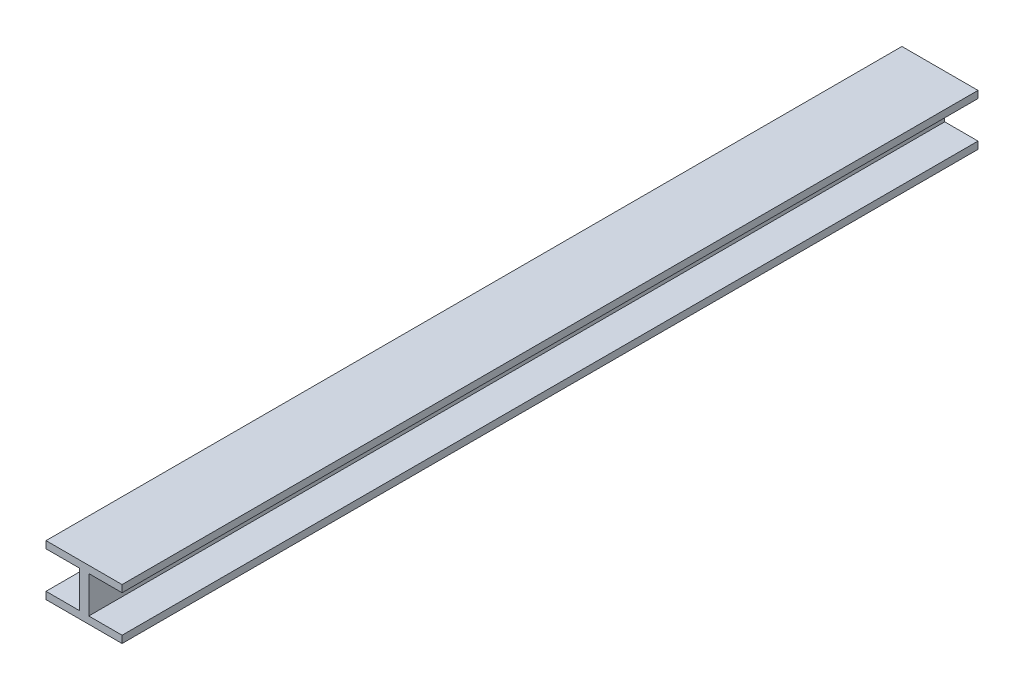
ISO-10303-21;
HEADER;
FILE_DESCRIPTION(('STEP AP214'),'2;1');
FILE_NAME('part.step','',(''),(''),'','','');
FILE_SCHEMA(('AUTOMOTIVE_DESIGN { 1 0 10303 214 1 1 1 1 }'));
ENDSEC;
DATA;
#1=APPLICATION_CONTEXT('core data for automotive mechanical design processes');
#2=APPLICATION_PROTOCOL_DEFINITION('international standard','automotive_design',2000,#1);
#3=PRODUCT_CONTEXT('',#1,'mechanical');
#4=PRODUCT('Part','Part','',(#3));
#5=PRODUCT_RELATED_PRODUCT_CATEGORY('part','',(#4));
#6=PRODUCT_DEFINITION_FORMATION('','',#4);
#7=PRODUCT_DEFINITION_CONTEXT('part definition',#1,'design');
#8=PRODUCT_DEFINITION('design','',#6,#7);
#9=PRODUCT_DEFINITION_SHAPE('','',#8);
#10=(LENGTH_UNIT() NAMED_UNIT(*) SI_UNIT(.MILLI.,.METRE.));
#11=(NAMED_UNIT(*) PLANE_ANGLE_UNIT() SI_UNIT($,.RADIAN.));
#12=(NAMED_UNIT(*) SI_UNIT($,.STERADIAN.) SOLID_ANGLE_UNIT());
#13=UNCERTAINTY_MEASURE_WITH_UNIT(LENGTH_MEASURE(1.E-05),#10,'distance_accuracy_value','');
#14=(GEOMETRIC_REPRESENTATION_CONTEXT(3) GLOBAL_UNCERTAINTY_ASSIGNED_CONTEXT((#13)) GLOBAL_UNIT_ASSIGNED_CONTEXT((#10,
#11,#12)) REPRESENTATION_CONTEXT('',''));
#15=CARTESIAN_POINT('',(0.,0.,0.));
#16=DIRECTION('',(0.,0.,1.));
#17=DIRECTION('',(1.,0.,0.));
#18=AXIS2_PLACEMENT_3D('',#15,#16,#17);
#19=CARTESIAN_POINT('',(0.,19.3373493975904,450.));
#20=DIRECTION('',(1.,0.,0.));
#21=DIRECTION('',(0.,0.,-1.));
#22=AXIS2_PLACEMENT_3D('',#19,#20,#21);
#23=PLANE('',#22);
#24=DIRECTION('',(0.,-1.,0.));
#25=VECTOR('',#24,1.);
#26=CARTESIAN_POINT('',(0.,19.3373493975904,0.));
#27=LINE('',#26,#25);
#28=CARTESIAN_POINT('',(0.,19.3373493975904,0.));
#29=VERTEX_POINT('',#28);
#30=CARTESIAN_POINT('',(0.,0.,0.));
#31=VERTEX_POINT('',#30);
#32=EDGE_CURVE('E153',#29,#31,#27,.T.);
#33=ORIENTED_EDGE('',*,*,#32,.T.);
#34=DIRECTION('',(0.,0.,-1.));
#35=VECTOR('',#34,1.);
#36=CARTESIAN_POINT('',(0.,0.,450.));
#37=LINE('',#36,#35);
#38=CARTESIAN_POINT('',(0.,0.,450.));
#39=VERTEX_POINT('',#38);
#40=EDGE_CURVE('E11',#39,#31,#37,.T.);
#41=ORIENTED_EDGE('',*,*,#40,.F.);
#42=DIRECTION('',(0.,-1.,0.));
#43=VECTOR('',#42,1.);
#44=CARTESIAN_POINT('',(0.,19.3373493975904,450.));
#45=LINE('',#44,#43);
#46=CARTESIAN_POINT('',(0.,19.3373493975904,450.));
#47=VERTEX_POINT('',#46);
#48=EDGE_CURVE('E175',#47,#39,#45,.T.);
#49=ORIENTED_EDGE('',*,*,#48,.F.);
#50=DIRECTION('',(0.,0.,-1.));
#51=VECTOR('',#50,1.);
#52=CARTESIAN_POINT('',(0.,19.3373493975904,450.));
#53=LINE('',#52,#51);
#54=EDGE_CURVE('E149',#47,#29,#53,.T.);
#55=ORIENTED_EDGE('',*,*,#54,.T.);
#56=EDGE_LOOP('',(#33,#41,#49,#55));
#57=FACE_BOUND('',#56,.T.);
#58=ADVANCED_FACE('F33',(#57),#23,.F.);
#59=CARTESIAN_POINT('',(0.,0.,450.));
#60=DIRECTION('',(0.,-1.,0.));
#61=DIRECTION('',(1.,0.,0.));
#62=AXIS2_PLACEMENT_3D('',#59,#60,#61);
#63=PLANE('',#62);
#64=DIRECTION('',(-1.,0.,0.));
#65=VECTOR('',#64,1.);
#66=CARTESIAN_POINT('',(0.,0.,0.));
#67=LINE('',#66,#65);
#68=CARTESIAN_POINT('',(-17.5,0.,0.));
#69=VERTEX_POINT('',#68);
#70=EDGE_CURVE('E156',#31,#69,#67,.T.);
#71=ORIENTED_EDGE('',*,*,#70,.T.);
#72=DIRECTION('',(0.,0.,-1.));
#73=VECTOR('',#72,1.);
#74=CARTESIAN_POINT('',(-17.5,0.,450.));
#75=LINE('',#74,#73);
#76=CARTESIAN_POINT('',(-17.5,0.,450.));
#77=VERTEX_POINT('',#76);
#78=EDGE_CURVE('E41',#77,#69,#75,.T.);
#79=ORIENTED_EDGE('',*,*,#78,.F.);
#80=DIRECTION('',(-1.,0.,0.));
#81=VECTOR('',#80,1.);
#82=CARTESIAN_POINT('',(0.,0.,450.));
#83=LINE('',#82,#81);
#84=EDGE_CURVE('E104',#39,#77,#83,.T.);
#85=ORIENTED_EDGE('',*,*,#84,.F.);
#86=ORIENTED_EDGE('',*,*,#40,.T.);
#87=EDGE_LOOP('',(#71,#79,#85,#86));
#88=FACE_BOUND('',#87,.T.);
#89=ADVANCED_FACE('F253',(#88),#63,.F.);
#90=CARTESIAN_POINT('',(-17.5,0.,450.));
#91=DIRECTION('',(1.,0.,0.));
#92=DIRECTION('',(0.,0.,-1.));
#93=AXIS2_PLACEMENT_3D('',#90,#91,#92);
#94=PLANE('',#93);
#95=DIRECTION('',(0.,-1.,0.));
#96=VECTOR('',#95,1.);
#97=CARTESIAN_POINT('',(-17.5,0.,0.));
#98=LINE('',#97,#96);
#99=CARTESIAN_POINT('',(-17.5,-3.79518072289157,0.));
#100=VERTEX_POINT('',#99);
#101=EDGE_CURVE('E158',#69,#100,#98,.T.);
#102=ORIENTED_EDGE('',*,*,#101,.T.);
#103=DIRECTION('',(0.,0.,-1.));
#104=VECTOR('',#103,1.);
#105=CARTESIAN_POINT('',(-17.5,-3.79518072289157,450.));
#106=LINE('',#105,#104);
#107=CARTESIAN_POINT('',(-17.5,-3.79518072289157,450.));
#108=VERTEX_POINT('',#107);
#109=EDGE_CURVE('E194',#108,#100,#106,.T.);
#110=ORIENTED_EDGE('',*,*,#109,.F.);
#111=DIRECTION('',(0.,-1.,0.));
#112=VECTOR('',#111,1.);
#113=CARTESIAN_POINT('',(-17.5,0.,450.));
#114=LINE('',#113,#112);
#115=EDGE_CURVE('E202',#77,#108,#114,.T.);
#116=ORIENTED_EDGE('',*,*,#115,.F.);
#117=ORIENTED_EDGE('',*,*,#78,.T.);
#118=EDGE_LOOP('',(#102,#110,#116,#117));
#119=FACE_BOUND('',#118,.T.);
#120=ADVANCED_FACE('F200',(#119),#94,.F.);
#121=CARTESIAN_POINT('',(-17.5,-3.79518072289157,450.));
#122=DIRECTION('',(0.,1.,0.));
#123=DIRECTION('',(0.,0.,1.));
#124=AXIS2_PLACEMENT_3D('',#121,#122,#123);
#125=PLANE('',#124);
#126=DIRECTION('',(1.,0.,0.));
#127=VECTOR('',#126,1.);
#128=CARTESIAN_POINT('',(-17.5,-3.79518072289157,0.));
#129=LINE('',#128,#127);
#130=CARTESIAN_POINT('',(22.5,-3.79518072289157,0.));
#131=VERTEX_POINT('',#130);
#132=EDGE_CURVE('E160',#100,#131,#129,.T.);
#133=ORIENTED_EDGE('',*,*,#132,.T.);
#134=DIRECTION('',(0.,0.,-1.));
#135=VECTOR('',#134,1.);
#136=CARTESIAN_POINT('',(22.5,-3.79518072289157,450.));
#137=LINE('',#136,#135);
#138=CARTESIAN_POINT('',(22.5,-3.79518072289157,450.));
#139=VERTEX_POINT('',#138);
#140=EDGE_CURVE('E191',#139,#131,#137,.T.);
#141=ORIENTED_EDGE('',*,*,#140,.F.);
#142=DIRECTION('',(1.,0.,0.));
#143=VECTOR('',#142,1.);
#144=CARTESIAN_POINT('',(-17.5,-3.79518072289157,450.));
#145=LINE('',#144,#143);
#146=EDGE_CURVE('E220',#108,#139,#145,.T.);
#147=ORIENTED_EDGE('',*,*,#146,.F.);
#148=ORIENTED_EDGE('',*,*,#109,.T.);
#149=EDGE_LOOP('',(#133,#141,#147,#148));
#150=FACE_BOUND('',#149,.T.);
#151=ADVANCED_FACE('F211',(#150),#125,.F.);
#152=CARTESIAN_POINT('',(22.5,-3.79518072289157,450.));
#153=DIRECTION('',(-1.,0.,0.));
#154=DIRECTION('',(0.,0.,1.));
#155=AXIS2_PLACEMENT_3D('',#152,#153,#154);
#156=PLANE('',#155);
#157=DIRECTION('',(0.,1.,0.));
#158=VECTOR('',#157,1.);
#159=CARTESIAN_POINT('',(22.5,-3.79518072289157,0.));
#160=LINE('',#159,#158);
#161=CARTESIAN_POINT('',(22.5,0.,0.));
#162=VERTEX_POINT('',#161);
#163=EDGE_CURVE('E162',#131,#162,#160,.T.);
#164=ORIENTED_EDGE('',*,*,#163,.T.);
#165=DIRECTION('',(0.,0.,-1.));
#166=VECTOR('',#165,1.);
#167=CARTESIAN_POINT('',(22.5,0.,450.));
#168=LINE('',#167,#166);
#169=CARTESIAN_POINT('',(22.5,0.,450.));
#170=VERTEX_POINT('',#169);
#171=EDGE_CURVE('E188',#170,#162,#168,.T.);
#172=ORIENTED_EDGE('',*,*,#171,.F.);
#173=DIRECTION('',(0.,1.,0.));
#174=VECTOR('',#173,1.);
#175=CARTESIAN_POINT('',(22.5,-3.79518072289157,450.));
#176=LINE('',#175,#174);
#177=EDGE_CURVE('E217',#139,#170,#176,.T.);
#178=ORIENTED_EDGE('',*,*,#177,.F.);
#179=ORIENTED_EDGE('',*,*,#140,.T.);
#180=EDGE_LOOP('',(#164,#172,#178,#179));
#181=FACE_BOUND('',#180,.T.);
#182=ADVANCED_FACE('F215',(#181),#156,.F.);
#183=CARTESIAN_POINT('',(22.5,0.,450.));
#184=DIRECTION('',(0.,-1.,0.));
#185=DIRECTION('',(1.,0.,0.));
#186=AXIS2_PLACEMENT_3D('',#183,#184,#185);
#187=PLANE('',#186);
#188=DIRECTION('',(-1.,0.,0.));
#189=VECTOR('',#188,1.);
#190=CARTESIAN_POINT('',(22.5,0.,0.));
#191=LINE('',#190,#189);
#192=CARTESIAN_POINT('',(5.,0.,0.));
#193=VERTEX_POINT('',#192);
#194=EDGE_CURVE('E164',#162,#193,#191,.T.);
#195=ORIENTED_EDGE('',*,*,#194,.T.);
#196=DIRECTION('',(0.,0.,-1.));
#197=VECTOR('',#196,1.);
#198=CARTESIAN_POINT('',(5.,0.,450.));
#199=LINE('',#198,#197);
#200=CARTESIAN_POINT('',(5.,0.,450.));
#201=VERTEX_POINT('',#200);
#202=EDGE_CURVE('E185',#201,#193,#199,.T.);
#203=ORIENTED_EDGE('',*,*,#202,.F.);
#204=DIRECTION('',(-1.,0.,0.));
#205=VECTOR('',#204,1.);
#206=CARTESIAN_POINT('',(22.5,0.,450.));
#207=LINE('',#206,#205);
#208=EDGE_CURVE('E219',#170,#201,#207,.T.);
#209=ORIENTED_EDGE('',*,*,#208,.F.);
#210=ORIENTED_EDGE('',*,*,#171,.T.);
#211=EDGE_LOOP('',(#195,#203,#209,#210));
#212=FACE_BOUND('',#211,.T.);
#213=ADVANCED_FACE('F266',(#212),#187,.F.);
#214=CARTESIAN_POINT('',(5.,0.,450.));
#215=DIRECTION('',(-1.,0.,0.));
#216=DIRECTION('',(0.,-1.,0.));
#217=AXIS2_PLACEMENT_3D('',#214,#215,#216);
#218=PLANE('',#217);
#219=DIRECTION('',(0.,1.,0.));
#220=VECTOR('',#219,1.);
#221=CARTESIAN_POINT('',(5.,0.,0.));
#222=LINE('',#221,#220);
#223=CARTESIAN_POINT('',(5.,19.3373493975904,0.));
#224=VERTEX_POINT('',#223);
#225=EDGE_CURVE('E166',#193,#224,#222,.T.);
#226=ORIENTED_EDGE('',*,*,#225,.T.);
#227=DIRECTION('',(0.,0.,-1.));
#228=VECTOR('',#227,1.);
#229=CARTESIAN_POINT('',(5.,19.3373493975904,450.));
#230=LINE('',#229,#228);
#231=CARTESIAN_POINT('',(5.,19.3373493975904,450.));
#232=VERTEX_POINT('',#231);
#233=EDGE_CURVE('E182',#232,#224,#230,.T.);
#234=ORIENTED_EDGE('',*,*,#233,.F.);
#235=DIRECTION('',(0.,1.,0.));
#236=VECTOR('',#235,1.);
#237=CARTESIAN_POINT('',(5.,0.,450.));
#238=LINE('',#237,#236);
#239=EDGE_CURVE('E222',#201,#232,#238,.T.);
#240=ORIENTED_EDGE('',*,*,#239,.F.);
#241=ORIENTED_EDGE('',*,*,#202,.T.);
#242=EDGE_LOOP('',(#226,#234,#240,#241));
#243=FACE_BOUND('',#242,.T.);
#244=ADVANCED_FACE('F269',(#243),#218,.F.);
#245=CARTESIAN_POINT('',(5.,19.3373493975904,450.));
#246=DIRECTION('',(0.,1.,0.));
#247=DIRECTION('',(0.,0.,1.));
#248=AXIS2_PLACEMENT_3D('',#245,#246,#247);
#249=PLANE('',#248);
#250=DIRECTION('',(1.,0.,0.));
#251=VECTOR('',#250,1.);
#252=CARTESIAN_POINT('',(5.,19.3373493975904,0.));
#253=LINE('',#252,#251);
#254=CARTESIAN_POINT('',(22.5,19.3373493975904,0.));
#255=VERTEX_POINT('',#254);
#256=EDGE_CURVE('E168',#224,#255,#253,.T.);
#257=ORIENTED_EDGE('',*,*,#256,.T.);
#258=DIRECTION('',(0.,0.,-1.));
#259=VECTOR('',#258,1.);
#260=CARTESIAN_POINT('',(22.5,19.3373493975904,450.));
#261=LINE('',#260,#259);
#262=CARTESIAN_POINT('',(22.5,19.3373493975904,450.));
#263=VERTEX_POINT('',#262);
#264=EDGE_CURVE('E179',#263,#255,#261,.T.);
#265=ORIENTED_EDGE('',*,*,#264,.F.);
#266=DIRECTION('',(1.,0.,0.));
#267=VECTOR('',#266,1.);
#268=CARTESIAN_POINT('',(5.,19.3373493975904,450.));
#269=LINE('',#268,#267);
#270=EDGE_CURVE('E228',#232,#263,#269,.T.);
#271=ORIENTED_EDGE('',*,*,#270,.F.);
#272=ORIENTED_EDGE('',*,*,#233,.T.);
#273=EDGE_LOOP('',(#257,#265,#271,#272));
#274=FACE_BOUND('',#273,.T.);
#275=ADVANCED_FACE('F234',(#274),#249,.F.);
#276=CARTESIAN_POINT('',(22.5,19.3373493975904,450.));
#277=DIRECTION('',(-1.,0.,0.));
#278=DIRECTION('',(0.,0.,1.));
#279=AXIS2_PLACEMENT_3D('',#276,#277,#278);
#280=PLANE('',#279);
#281=DIRECTION('',(0.,1.,0.));
#282=VECTOR('',#281,1.);
#283=CARTESIAN_POINT('',(22.5,19.3373493975904,0.));
#284=LINE('',#283,#282);
#285=CARTESIAN_POINT('',(22.5,23.0722891566265,0.));
#286=VERTEX_POINT('',#285);
#287=EDGE_CURVE('E170',#255,#286,#284,.T.);
#288=ORIENTED_EDGE('',*,*,#287,.T.);
#289=DIRECTION('',(0.,0.,-1.));
#290=VECTOR('',#289,1.);
#291=CARTESIAN_POINT('',(22.5,23.0722891566265,450.));
#292=LINE('',#291,#290);
#293=CARTESIAN_POINT('',(22.5,23.0722891566265,450.));
#294=VERTEX_POINT('',#293);
#295=EDGE_CURVE('E144',#294,#286,#292,.T.);
#296=ORIENTED_EDGE('',*,*,#295,.F.);
#297=DIRECTION('',(0.,1.,0.));
#298=VECTOR('',#297,1.);
#299=CARTESIAN_POINT('',(22.5,19.3373493975904,450.));
#300=LINE('',#299,#298);
#301=EDGE_CURVE('E135',#263,#294,#300,.T.);
#302=ORIENTED_EDGE('',*,*,#301,.F.);
#303=ORIENTED_EDGE('',*,*,#264,.T.);
#304=EDGE_LOOP('',(#288,#296,#302,#303));
#305=FACE_BOUND('',#304,.T.);
#306=ADVANCED_FACE('F238',(#305),#280,.F.);
#307=CARTESIAN_POINT('',(22.5,23.0722891566265,450.));
#308=DIRECTION('',(0.,-1.,0.));
#309=DIRECTION('',(1.,0.,0.));
#310=AXIS2_PLACEMENT_3D('',#307,#308,#309);
#311=PLANE('',#310);
#312=DIRECTION('',(-1.,0.,0.));
#313=VECTOR('',#312,1.);
#314=CARTESIAN_POINT('',(22.5,23.0722891566265,0.));
#315=LINE('',#314,#313);
#316=CARTESIAN_POINT('',(-17.5,23.0722891566265,0.));
#317=VERTEX_POINT('',#316);
#318=EDGE_CURVE('E143',#286,#317,#315,.T.);
#319=ORIENTED_EDGE('',*,*,#318,.T.);
#320=DIRECTION('',(0.,0.,-1.));
#321=VECTOR('',#320,1.);
#322=CARTESIAN_POINT('',(-17.5,23.0722891566265,450.));
#323=LINE('',#322,#321);
#324=CARTESIAN_POINT('',(-17.5,23.0722891566265,450.));
#325=VERTEX_POINT('',#324);
#326=EDGE_CURVE('E140',#325,#317,#323,.T.);
#327=ORIENTED_EDGE('',*,*,#326,.F.);
#328=DIRECTION('',(-1.,0.,0.));
#329=VECTOR('',#328,1.);
#330=CARTESIAN_POINT('',(22.5,23.0722891566265,450.));
#331=LINE('',#330,#329);
#332=EDGE_CURVE('E129',#294,#325,#331,.T.);
#333=ORIENTED_EDGE('',*,*,#332,.F.);
#334=ORIENTED_EDGE('',*,*,#295,.T.);
#335=EDGE_LOOP('',(#319,#327,#333,#334));
#336=FACE_BOUND('',#335,.T.);
#337=ADVANCED_FACE('F141',(#336),#311,.F.);
#338=CARTESIAN_POINT('',(-17.5,23.0722891566265,450.));
#339=DIRECTION('',(1.,0.,0.));
#340=DIRECTION('',(0.,0.,-1.));
#341=AXIS2_PLACEMENT_3D('',#338,#339,#340);
#342=PLANE('',#341);
#343=DIRECTION('',(0.,-1.,0.));
#344=VECTOR('',#343,1.);
#345=CARTESIAN_POINT('',(-17.5,23.0722891566265,0.));
#346=LINE('',#345,#344);
#347=CARTESIAN_POINT('',(-17.5,19.3373493975904,0.));
#348=VERTEX_POINT('',#347);
#349=EDGE_CURVE('E90',#317,#348,#346,.T.);
#350=ORIENTED_EDGE('',*,*,#349,.T.);
#351=DIRECTION('',(0.,0.,-1.));
#352=VECTOR('',#351,1.);
#353=CARTESIAN_POINT('',(-17.5,19.3373493975904,450.));
#354=LINE('',#353,#352);
#355=CARTESIAN_POINT('',(-17.5,19.3373493975904,450.));
#356=VERTEX_POINT('',#355);
#357=EDGE_CURVE('E145',#356,#348,#354,.T.);
#358=ORIENTED_EDGE('',*,*,#357,.F.);
#359=DIRECTION('',(0.,-1.,0.));
#360=VECTOR('',#359,1.);
#361=CARTESIAN_POINT('',(-17.5,23.0722891566265,450.));
#362=LINE('',#361,#360);
#363=EDGE_CURVE('E133',#325,#356,#362,.T.);
#364=ORIENTED_EDGE('',*,*,#363,.F.);
#365=ORIENTED_EDGE('',*,*,#326,.T.);
#366=EDGE_LOOP('',(#350,#358,#364,#365));
#367=FACE_BOUND('',#366,.T.);
#368=ADVANCED_FACE('F147',(#367),#342,.F.);
#369=CARTESIAN_POINT('',(-17.5,19.3373493975904,450.));
#370=DIRECTION('',(0.,1.,0.));
#371=DIRECTION('',(0.,0.,1.));
#372=AXIS2_PLACEMENT_3D('',#369,#370,#371);
#373=PLANE('',#372);
#374=DIRECTION('',(1.,0.,0.));
#375=VECTOR('',#374,1.);
#376=CARTESIAN_POINT('',(-17.5,19.3373493975904,0.));
#377=LINE('',#376,#375);
#378=EDGE_CURVE('E96',#348,#29,#377,.T.);
#379=ORIENTED_EDGE('',*,*,#378,.T.);
#380=ORIENTED_EDGE('',*,*,#54,.F.);
#381=DIRECTION('',(1.,0.,0.));
#382=VECTOR('',#381,1.);
#383=CARTESIAN_POINT('',(-17.5,19.3373493975904,450.));
#384=LINE('',#383,#382);
#385=EDGE_CURVE('E49',#356,#47,#384,.T.);
#386=ORIENTED_EDGE('',*,*,#385,.F.);
#387=ORIENTED_EDGE('',*,*,#357,.T.);
#388=EDGE_LOOP('',(#379,#380,#386,#387));
#389=FACE_BOUND('',#388,.T.);
#390=ADVANCED_FACE('F242',(#389),#373,.F.);
#391=CARTESIAN_POINT('',(0.,0.,450.));
#392=DIRECTION('',(0.,0.,-1.));
#393=DIRECTION('',(-1.,0.,0.));
#394=AXIS2_PLACEMENT_3D('',#391,#392,#393);
#395=PLANE('',#394);
#396=ORIENTED_EDGE('',*,*,#48,.T.);
#397=ORIENTED_EDGE('',*,*,#84,.T.);
#398=ORIENTED_EDGE('',*,*,#115,.T.);
#399=ORIENTED_EDGE('',*,*,#146,.T.);
#400=ORIENTED_EDGE('',*,*,#177,.T.);
#401=ORIENTED_EDGE('',*,*,#208,.T.);
#402=ORIENTED_EDGE('',*,*,#239,.T.);
#403=ORIENTED_EDGE('',*,*,#270,.T.);
#404=ORIENTED_EDGE('',*,*,#301,.T.);
#405=ORIENTED_EDGE('',*,*,#332,.T.);
#406=ORIENTED_EDGE('',*,*,#363,.T.);
#407=ORIENTED_EDGE('',*,*,#385,.T.);
#408=EDGE_LOOP('',(#396,#397,#398,#399,#400,#401,#402,#403,#404,#405,#406,#407));
#409=FACE_BOUND('',#408,.T.);
#410=ADVANCED_FACE('F131',(#409),#395,.F.);
#411=CARTESIAN_POINT('',(0.,0.,0.));
#412=DIRECTION('',(0.,0.,-1.));
#413=DIRECTION('',(-1.,0.,0.));
#414=AXIS2_PLACEMENT_3D('',#411,#412,#413);
#415=PLANE('',#414);
#416=ORIENTED_EDGE('',*,*,#32,.F.);
#417=ORIENTED_EDGE('',*,*,#378,.F.);
#418=ORIENTED_EDGE('',*,*,#349,.F.);
#419=ORIENTED_EDGE('',*,*,#318,.F.);
#420=ORIENTED_EDGE('',*,*,#287,.F.);
#421=ORIENTED_EDGE('',*,*,#256,.F.);
#422=ORIENTED_EDGE('',*,*,#225,.F.);
#423=ORIENTED_EDGE('',*,*,#194,.F.);
#424=ORIENTED_EDGE('',*,*,#163,.F.);
#425=ORIENTED_EDGE('',*,*,#132,.F.);
#426=ORIENTED_EDGE('',*,*,#101,.F.);
#427=ORIENTED_EDGE('',*,*,#70,.F.);
#428=EDGE_LOOP('',(#416,#417,#418,#419,#420,#421,#422,#423,#424,#425,#426,#427));
#429=FACE_BOUND('',#428,.T.);
#430=ADVANCED_FACE('F206',(#429),#415,.T.);
#431=CLOSED_SHELL('',(#58,#89,#120,#151,#182,#213,#244,#275,#306,#337,#368,#390,#410,#430));
#432=MANIFOLD_SOLID_BREP('B2',#431);
#433=ADVANCED_BREP_SHAPE_REPRESENTATION('',(#18,#432),#14);
#434=SHAPE_DEFINITION_REPRESENTATION(#9,#433);
ENDSEC;
END-ISO-10303-21;
